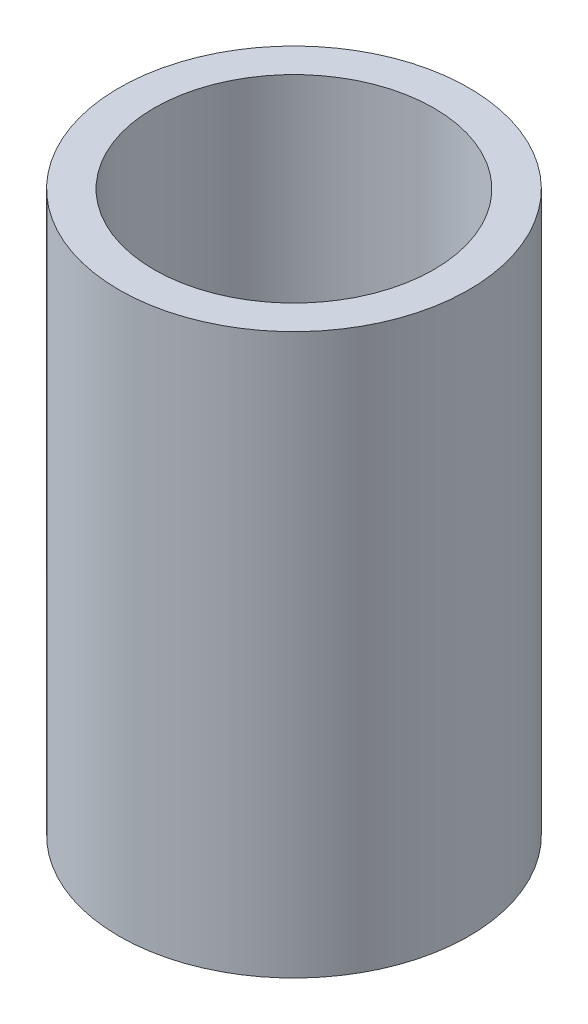
ISO-10303-21;
HEADER;
FILE_DESCRIPTION(('STEP AP214'),'2;1');
FILE_NAME('part.step','',(''),(''),'','','');
FILE_SCHEMA(('AUTOMOTIVE_DESIGN { 1 0 10303 214 1 1 1 1 }'));
ENDSEC;
DATA;
#1=APPLICATION_CONTEXT('core data for automotive mechanical design processes');
#2=APPLICATION_PROTOCOL_DEFINITION('international standard','automotive_design',2000,#1);
#3=PRODUCT_CONTEXT('',#1,'mechanical');
#4=PRODUCT('Part','Part','',(#3));
#5=PRODUCT_RELATED_PRODUCT_CATEGORY('part','',(#4));
#6=PRODUCT_DEFINITION_FORMATION('','',#4);
#7=PRODUCT_DEFINITION_CONTEXT('part definition',#1,'design');
#8=PRODUCT_DEFINITION('design','',#6,#7);
#9=PRODUCT_DEFINITION_SHAPE('','',#8);
#10=(LENGTH_UNIT() NAMED_UNIT(*) SI_UNIT(.MILLI.,.METRE.));
#11=(NAMED_UNIT(*) PLANE_ANGLE_UNIT() SI_UNIT($,.RADIAN.));
#12=(NAMED_UNIT(*) SI_UNIT($,.STERADIAN.) SOLID_ANGLE_UNIT());
#13=UNCERTAINTY_MEASURE_WITH_UNIT(LENGTH_MEASURE(1.E-05),#10,'distance_accuracy_value','');
#14=(GEOMETRIC_REPRESENTATION_CONTEXT(3) GLOBAL_UNCERTAINTY_ASSIGNED_CONTEXT((#13)) GLOBAL_UNIT_ASSIGNED_CONTEXT((#10,
#11,#12)) REPRESENTATION_CONTEXT('',''));
#15=CARTESIAN_POINT('',(0.,0.,0.));
#16=DIRECTION('',(0.,0.,1.));
#17=DIRECTION('',(1.,0.,0.));
#18=AXIS2_PLACEMENT_3D('',#15,#16,#17);
#19=CARTESIAN_POINT('',(0.,16.,0.));
#20=DIRECTION('',(0.,1.,0.));
#21=DIRECTION('',(0.,0.,1.));
#22=AXIS2_PLACEMENT_3D('',#19,#20,#21);
#23=PLANE('',#22);
#24=CARTESIAN_POINT('',(0.,16.,0.));
#25=DIRECTION('',(0.,1.,0.));
#26=DIRECTION('',(0.,0.,1.));
#27=AXIS2_PLACEMENT_3D('',#24,#25,#26);
#28=CIRCLE('',#27,5.);
#29=CARTESIAN_POINT('',(0.,16.,5.));
#30=VERTEX_POINT('',#29);
#31=EDGE_CURVE('E10',#30,#30,#28,.T.);
#32=ORIENTED_EDGE('',*,*,#31,.T.);
#33=EDGE_LOOP('',(#32));
#34=FACE_BOUND('',#33,.T.);
#35=CARTESIAN_POINT('',(0.,16.,0.));
#36=DIRECTION('',(0.,1.,0.));
#37=DIRECTION('',(0.,0.,1.));
#38=AXIS2_PLACEMENT_3D('',#35,#36,#37);
#39=CIRCLE('',#38,4.);
#40=CARTESIAN_POINT('',(0.,16.,4.));
#41=VERTEX_POINT('',#40);
#42=EDGE_CURVE('E41',#41,#41,#39,.T.);
#43=ORIENTED_EDGE('',*,*,#42,.F.);
#44=EDGE_LOOP('',(#43));
#45=FACE_BOUND('',#44,.T.);
#46=ADVANCED_FACE('F30',(#34,#45),#23,.T.);
#47=CARTESIAN_POINT('',(0.,0.,0.));
#48=DIRECTION('',(0.,1.,0.));
#49=DIRECTION('',(0.,0.,1.));
#50=AXIS2_PLACEMENT_3D('',#47,#48,#49);
#51=PLANE('',#50);
#52=CARTESIAN_POINT('',(0.,0.,0.));
#53=DIRECTION('',(0.,1.,0.));
#54=DIRECTION('',(0.,0.,1.));
#55=AXIS2_PLACEMENT_3D('',#52,#53,#54);
#56=CIRCLE('',#55,5.);
#57=CARTESIAN_POINT('',(0.,0.,5.));
#58=VERTEX_POINT('',#57);
#59=EDGE_CURVE('E34',#58,#58,#56,.T.);
#60=ORIENTED_EDGE('',*,*,#59,.F.);
#61=EDGE_LOOP('',(#60));
#62=FACE_BOUND('',#61,.T.);
#63=CARTESIAN_POINT('',(0.,0.,0.));
#64=DIRECTION('',(0.,1.,0.));
#65=DIRECTION('',(0.,0.,1.));
#66=AXIS2_PLACEMENT_3D('',#63,#64,#65);
#67=CIRCLE('',#66,4.);
#68=CARTESIAN_POINT('',(0.,0.,4.));
#69=VERTEX_POINT('',#68);
#70=EDGE_CURVE('E43',#69,#69,#67,.T.);
#71=ORIENTED_EDGE('',*,*,#70,.T.);
#72=EDGE_LOOP('',(#71));
#73=FACE_BOUND('',#72,.T.);
#74=ADVANCED_FACE('F53',(#62,#73),#51,.F.);
#75=CARTESIAN_POINT('',(0.,16.,0.));
#76=DIRECTION('',(0.,-1.,0.));
#77=DIRECTION('',(0.,0.,-1.));
#78=AXIS2_PLACEMENT_3D('',#75,#76,#77);
#79=CYLINDRICAL_SURFACE('',#78,5.);
#80=ORIENTED_EDGE('',*,*,#31,.F.);
#81=EDGE_LOOP('',(#80));
#82=FACE_BOUND('',#81,.T.);
#83=ORIENTED_EDGE('',*,*,#59,.T.);
#84=EDGE_LOOP('',(#83));
#85=FACE_BOUND('',#84,.T.);
#86=ADVANCED_FACE('F32',(#82,#85),#79,.T.);
#87=CARTESIAN_POINT('',(0.,16.,0.));
#88=DIRECTION('',(0.,-1.,0.));
#89=DIRECTION('',(0.,0.,-1.));
#90=AXIS2_PLACEMENT_3D('',#87,#88,#89);
#91=CYLINDRICAL_SURFACE('',#90,4.);
#92=ORIENTED_EDGE('',*,*,#42,.T.);
#93=EDGE_LOOP('',(#92));
#94=FACE_BOUND('',#93,.T.);
#95=ORIENTED_EDGE('',*,*,#70,.F.);
#96=EDGE_LOOP('',(#95));
#97=FACE_BOUND('',#96,.T.);
#98=ADVANCED_FACE('F49',(#94,#97),#91,.F.);
#99=CLOSED_SHELL('',(#46,#74,#86,#98));
#100=MANIFOLD_SOLID_BREP('B2',#99);
#101=ADVANCED_BREP_SHAPE_REPRESENTATION('',(#18,#100),#14);
#102=SHAPE_DEFINITION_REPRESENTATION(#9,#101);
ENDSEC;
END-ISO-10303-21;
